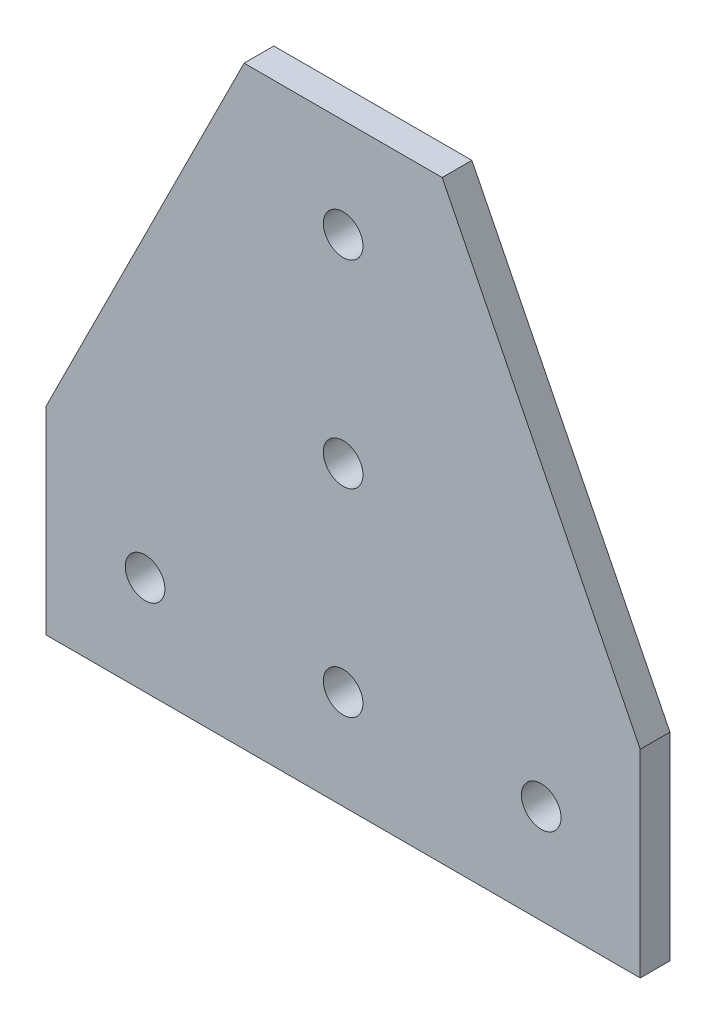
ISO-10303-21;
HEADER;
FILE_DESCRIPTION(('STEP AP214'),'2;1');
FILE_NAME('part.step','',(''),(''),'','','');
FILE_SCHEMA(('AUTOMOTIVE_DESIGN { 1 0 10303 214 1 1 1 1 }'));
ENDSEC;
DATA;
#1=APPLICATION_CONTEXT('core data for automotive mechanical design processes');
#2=APPLICATION_PROTOCOL_DEFINITION('international standard','automotive_design',2000,#1);
#3=PRODUCT_CONTEXT('',#1,'mechanical');
#4=PRODUCT('Part','Part','',(#3));
#5=PRODUCT_RELATED_PRODUCT_CATEGORY('part','',(#4));
#6=PRODUCT_DEFINITION_FORMATION('','',#4);
#7=PRODUCT_DEFINITION_CONTEXT('part definition',#1,'design');
#8=PRODUCT_DEFINITION('design','',#6,#7);
#9=PRODUCT_DEFINITION_SHAPE('','',#8);
#10=(LENGTH_UNIT() NAMED_UNIT(*) SI_UNIT(.MILLI.,.METRE.));
#11=(NAMED_UNIT(*) PLANE_ANGLE_UNIT() SI_UNIT($,.RADIAN.));
#12=(NAMED_UNIT(*) SI_UNIT($,.STERADIAN.) SOLID_ANGLE_UNIT());
#13=UNCERTAINTY_MEASURE_WITH_UNIT(LENGTH_MEASURE(1.E-05),#10,'distance_accuracy_value','');
#14=(GEOMETRIC_REPRESENTATION_CONTEXT(3) GLOBAL_UNCERTAINTY_ASSIGNED_CONTEXT((#13)) GLOBAL_UNIT_ASSIGNED_CONTEXT((#10,
#11,#12)) REPRESENTATION_CONTEXT('',''));
#15=CARTESIAN_POINT('',(0.,0.,0.));
#16=DIRECTION('',(0.,0.,1.));
#17=DIRECTION('',(1.,0.,0.));
#18=AXIS2_PLACEMENT_3D('',#15,#16,#17);
#19=CARTESIAN_POINT('',(0.,0.,3.));
#20=DIRECTION('',(0.,0.,1.));
#21=DIRECTION('',(1.,0.,0.));
#22=AXIS2_PLACEMENT_3D('',#19,#20,#21);
#23=PLANE('',#22);
#24=CARTESIAN_POINT('',(31.3459687494081,-73.3661563532401,3.));
#25=DIRECTION('',(0.,0.,1.));
#26=DIRECTION('',(1.,0.,0.));
#27=AXIS2_PLACEMENT_3D('',#24,#25,#26);
#28=CIRCLE('',#27,2.);
#29=CARTESIAN_POINT('',(33.3459687494081,-73.3661563532401,3.));
#30=VERTEX_POINT('',#29);
#31=EDGE_CURVE('E222',#30,#30,#28,.T.);
#32=ORIENTED_EDGE('',*,*,#31,.F.);
#33=EDGE_LOOP('',(#32));
#34=FACE_BOUND('',#33,.T.);
#35=CARTESIAN_POINT('',(31.3459687494081,-53.36615635324,3.));
#36=DIRECTION('',(0.,0.,1.));
#37=DIRECTION('',(1.,0.,0.));
#38=AXIS2_PLACEMENT_3D('',#35,#36,#37);
#39=CIRCLE('',#38,1.99999999999911);
#40=CARTESIAN_POINT('',(33.3459687494072,-53.36615635324,3.));
#41=VERTEX_POINT('',#40);
#42=EDGE_CURVE('E238',#41,#41,#39,.T.);
#43=ORIENTED_EDGE('',*,*,#42,.F.);
#44=EDGE_LOOP('',(#43));
#45=FACE_BOUND('',#44,.T.);
#46=DIRECTION('',(0.,-1.,0.));
#47=VECTOR('',#46,1.);
#48=CARTESIAN_POINT('',(1.34596874940809,-63.3661563532401,3.));
#49=LINE('',#48,#47);
#50=CARTESIAN_POINT('',(1.34596874940809,-63.3661563532401,3.));
#51=VERTEX_POINT('',#50);
#52=CARTESIAN_POINT('',(1.34596874940809,-83.3661563532401,3.));
#53=VERTEX_POINT('',#52);
#54=EDGE_CURVE('E152',#51,#53,#49,.T.);
#55=ORIENTED_EDGE('',*,*,#54,.T.);
#56=DIRECTION('',(1.,0.,0.));
#57=VECTOR('',#56,1.);
#58=CARTESIAN_POINT('',(1.34596874940809,-83.3661563532401,3.));
#59=LINE('',#58,#57);
#60=CARTESIAN_POINT('',(61.3459687494081,-83.3661563532401,3.));
#61=VERTEX_POINT('',#60);
#62=EDGE_CURVE('E100',#53,#61,#59,.T.);
#63=ORIENTED_EDGE('',*,*,#62,.T.);
#64=DIRECTION('',(0.,1.,0.));
#65=VECTOR('',#64,1.);
#66=CARTESIAN_POINT('',(61.3459687494081,-83.3661563532401,3.));
#67=LINE('',#66,#65);
#68=CARTESIAN_POINT('',(61.3459687494081,-63.3661563532401,3.));
#69=VERTEX_POINT('',#68);
#70=EDGE_CURVE('E113',#61,#69,#67,.T.);
#71=ORIENTED_EDGE('',*,*,#70,.T.);
#72=DIRECTION('',(-0.447213595499957,0.894427190999916,0.));
#73=VECTOR('',#72,1.);
#74=CARTESIAN_POINT('',(61.3459687494081,-63.3661563532401,3.));
#75=LINE('',#74,#73);
#76=CARTESIAN_POINT('',(41.3459687494081,-23.36615635324,3.));
#77=VERTEX_POINT('',#76);
#78=EDGE_CURVE('E107',#69,#77,#75,.T.);
#79=ORIENTED_EDGE('',*,*,#78,.T.);
#80=DIRECTION('',(-1.,0.,0.));
#81=VECTOR('',#80,1.);
#82=CARTESIAN_POINT('',(41.3459687494081,-23.36615635324,3.));
#83=LINE('',#82,#81);
#84=CARTESIAN_POINT('',(21.3459687494081,-23.36615635324,3.));
#85=VERTEX_POINT('',#84);
#86=EDGE_CURVE('E111',#77,#85,#83,.T.);
#87=ORIENTED_EDGE('',*,*,#86,.T.);
#88=DIRECTION('',(-0.447213595499957,-0.894427190999916,0.));
#89=VECTOR('',#88,1.);
#90=CARTESIAN_POINT('',(21.3459687494081,-23.36615635324,3.));
#91=LINE('',#90,#89);
#92=EDGE_CURVE('E63',#85,#51,#91,.T.);
#93=ORIENTED_EDGE('',*,*,#92,.T.);
#94=EDGE_LOOP('',(#55,#63,#71,#79,#87,#93));
#95=FACE_BOUND('',#94,.T.);
#96=CARTESIAN_POINT('',(31.3459687494081,-33.36615635324,3.));
#97=DIRECTION('',(0.,0.,1.));
#98=DIRECTION('',(1.,0.,0.));
#99=AXIS2_PLACEMENT_3D('',#96,#97,#98);
#100=CIRCLE('',#99,2.00000000000005);
#101=CARTESIAN_POINT('',(33.3459687494081,-33.36615635324,3.));
#102=VERTEX_POINT('',#101);
#103=EDGE_CURVE('E140',#102,#102,#100,.T.);
#104=ORIENTED_EDGE('',*,*,#103,.F.);
#105=EDGE_LOOP('',(#104));
#106=FACE_BOUND('',#105,.T.);
#107=CARTESIAN_POINT('',(11.3459687494081,-73.3661563532401,3.));
#108=DIRECTION('',(0.,0.,1.));
#109=DIRECTION('',(1.,0.,0.));
#110=AXIS2_PLACEMENT_3D('',#107,#108,#109);
#111=CIRCLE('',#110,2.);
#112=CARTESIAN_POINT('',(13.3459687494081,-73.3661563532401,3.));
#113=VERTEX_POINT('',#112);
#114=EDGE_CURVE('E230',#113,#113,#111,.T.);
#115=ORIENTED_EDGE('',*,*,#114,.F.);
#116=EDGE_LOOP('',(#115));
#117=FACE_BOUND('',#116,.T.);
#118=CARTESIAN_POINT('',(51.3459687494081,-73.3661563532401,3.));
#119=DIRECTION('',(0.,0.,1.));
#120=DIRECTION('',(1.,0.,0.));
#121=AXIS2_PLACEMENT_3D('',#118,#119,#120);
#122=CIRCLE('',#121,2.00000000000002);
#123=CARTESIAN_POINT('',(53.3459687494081,-73.3661563532401,3.));
#124=VERTEX_POINT('',#123);
#125=EDGE_CURVE('E211',#124,#124,#122,.T.);
#126=ORIENTED_EDGE('',*,*,#125,.F.);
#127=EDGE_LOOP('',(#126));
#128=FACE_BOUND('',#127,.T.);
#129=ADVANCED_FACE('F45',(#34,#45,#95,#106,#117,#128),#23,.T.);
#130=CARTESIAN_POINT('',(0.,0.,0.));
#131=DIRECTION('',(0.,0.,1.));
#132=DIRECTION('',(1.,0.,0.));
#133=AXIS2_PLACEMENT_3D('',#130,#131,#132);
#134=PLANE('',#133);
#135=DIRECTION('',(0.,-1.,0.));
#136=VECTOR('',#135,1.);
#137=CARTESIAN_POINT('',(1.34596874940809,-63.3661563532401,0.));
#138=LINE('',#137,#136);
#139=CARTESIAN_POINT('',(1.34596874940809,-63.3661563532401,0.));
#140=VERTEX_POINT('',#139);
#141=CARTESIAN_POINT('',(1.34596874940809,-83.3661563532401,0.));
#142=VERTEX_POINT('',#141);
#143=EDGE_CURVE('E135',#140,#142,#138,.T.);
#144=ORIENTED_EDGE('',*,*,#143,.F.);
#145=DIRECTION('',(-0.447213595499957,-0.894427190999916,0.));
#146=VECTOR('',#145,1.);
#147=CARTESIAN_POINT('',(21.3459687494081,-23.36615635324,0.));
#148=LINE('',#147,#146);
#149=CARTESIAN_POINT('',(21.3459687494081,-23.36615635324,0.));
#150=VERTEX_POINT('',#149);
#151=EDGE_CURVE('E92',#150,#140,#148,.T.);
#152=ORIENTED_EDGE('',*,*,#151,.F.);
#153=DIRECTION('',(-1.,0.,0.));
#154=VECTOR('',#153,1.);
#155=CARTESIAN_POINT('',(41.3459687494081,-23.36615635324,0.));
#156=LINE('',#155,#154);
#157=CARTESIAN_POINT('',(41.3459687494081,-23.36615635324,0.));
#158=VERTEX_POINT('',#157);
#159=EDGE_CURVE('E86',#158,#150,#156,.T.);
#160=ORIENTED_EDGE('',*,*,#159,.F.);
#161=DIRECTION('',(-0.447213595499957,0.894427190999916,0.));
#162=VECTOR('',#161,1.);
#163=CARTESIAN_POINT('',(61.3459687494081,-63.3661563532401,0.));
#164=LINE('',#163,#162);
#165=CARTESIAN_POINT('',(61.3459687494081,-63.3661563532401,0.));
#166=VERTEX_POINT('',#165);
#167=EDGE_CURVE('E122',#166,#158,#164,.T.);
#168=ORIENTED_EDGE('',*,*,#167,.F.);
#169=DIRECTION('',(0.,1.,0.));
#170=VECTOR('',#169,1.);
#171=CARTESIAN_POINT('',(61.3459687494081,-83.3661563532401,0.));
#172=LINE('',#171,#170);
#173=CARTESIAN_POINT('',(61.3459687494081,-83.3661563532401,0.));
#174=VERTEX_POINT('',#173);
#175=EDGE_CURVE('E143',#174,#166,#172,.T.);
#176=ORIENTED_EDGE('',*,*,#175,.F.);
#177=DIRECTION('',(1.,0.,0.));
#178=VECTOR('',#177,1.);
#179=CARTESIAN_POINT('',(1.34596874940809,-83.3661563532401,0.));
#180=LINE('',#179,#178);
#181=EDGE_CURVE('E139',#142,#174,#180,.T.);
#182=ORIENTED_EDGE('',*,*,#181,.F.);
#183=EDGE_LOOP('',(#144,#152,#160,#168,#176,#182));
#184=FACE_BOUND('',#183,.T.);
#185=CARTESIAN_POINT('',(31.3459687494081,-33.36615635324,0.));
#186=DIRECTION('',(0.,0.,1.));
#187=DIRECTION('',(1.,0.,0.));
#188=AXIS2_PLACEMENT_3D('',#185,#186,#187);
#189=CIRCLE('',#188,2.00000000000005);
#190=CARTESIAN_POINT('',(33.3459687494081,-33.36615635324,0.));
#191=VERTEX_POINT('',#190);
#192=EDGE_CURVE('E242',#191,#191,#189,.T.);
#193=ORIENTED_EDGE('',*,*,#192,.T.);
#194=EDGE_LOOP('',(#193));
#195=FACE_BOUND('',#194,.T.);
#196=CARTESIAN_POINT('',(31.3459687494081,-53.36615635324,0.));
#197=DIRECTION('',(0.,0.,1.));
#198=DIRECTION('',(1.,0.,0.));
#199=AXIS2_PLACEMENT_3D('',#196,#197,#198);
#200=CIRCLE('',#199,1.99999999999911);
#201=CARTESIAN_POINT('',(33.3459687494072,-53.36615635324,0.));
#202=VERTEX_POINT('',#201);
#203=EDGE_CURVE('E234',#202,#202,#200,.T.);
#204=ORIENTED_EDGE('',*,*,#203,.T.);
#205=EDGE_LOOP('',(#204));
#206=FACE_BOUND('',#205,.T.);
#207=CARTESIAN_POINT('',(11.3459687494081,-73.3661563532401,0.));
#208=DIRECTION('',(0.,0.,1.));
#209=DIRECTION('',(1.,0.,0.));
#210=AXIS2_PLACEMENT_3D('',#207,#208,#209);
#211=CIRCLE('',#210,2.);
#212=CARTESIAN_POINT('',(13.3459687494081,-73.3661563532401,0.));
#213=VERTEX_POINT('',#212);
#214=EDGE_CURVE('E226',#213,#213,#211,.T.);
#215=ORIENTED_EDGE('',*,*,#214,.T.);
#216=EDGE_LOOP('',(#215));
#217=FACE_BOUND('',#216,.T.);
#218=CARTESIAN_POINT('',(31.3459687494081,-73.3661563532401,0.));
#219=DIRECTION('',(0.,0.,1.));
#220=DIRECTION('',(1.,0.,0.));
#221=AXIS2_PLACEMENT_3D('',#218,#219,#220);
#222=CIRCLE('',#221,2.);
#223=CARTESIAN_POINT('',(33.3459687494081,-73.3661563532401,0.));
#224=VERTEX_POINT('',#223);
#225=EDGE_CURVE('E219',#224,#224,#222,.T.);
#226=ORIENTED_EDGE('',*,*,#225,.T.);
#227=EDGE_LOOP('',(#226));
#228=FACE_BOUND('',#227,.T.);
#229=CARTESIAN_POINT('',(51.3459687494081,-73.3661563532401,0.));
#230=DIRECTION('',(0.,0.,1.));
#231=DIRECTION('',(1.,0.,0.));
#232=AXIS2_PLACEMENT_3D('',#229,#230,#231);
#233=CIRCLE('',#232,2.00000000000002);
#234=CARTESIAN_POINT('',(53.3459687494081,-73.3661563532401,0.));
#235=VERTEX_POINT('',#234);
#236=EDGE_CURVE('E214',#235,#235,#233,.T.);
#237=ORIENTED_EDGE('',*,*,#236,.T.);
#238=EDGE_LOOP('',(#237));
#239=FACE_BOUND('',#238,.T.);
#240=ADVANCED_FACE('F165',(#184,#195,#206,#217,#228,#239),#134,.F.);
#241=CARTESIAN_POINT('',(1.34596874940809,-63.3661563532401,3.));
#242=DIRECTION('',(1.,0.,0.));
#243=DIRECTION('',(0.,0.,-1.));
#244=AXIS2_PLACEMENT_3D('',#241,#242,#243);
#245=PLANE('',#244);
#246=ORIENTED_EDGE('',*,*,#143,.T.);
#247=DIRECTION('',(0.,0.,-1.));
#248=VECTOR('',#247,1.);
#249=CARTESIAN_POINT('',(1.34596874940809,-83.3661563532401,3.));
#250=LINE('',#249,#248);
#251=EDGE_CURVE('E11',#53,#142,#250,.T.);
#252=ORIENTED_EDGE('',*,*,#251,.F.);
#253=ORIENTED_EDGE('',*,*,#54,.F.);
#254=DIRECTION('',(0.,0.,-1.));
#255=VECTOR('',#254,1.);
#256=CARTESIAN_POINT('',(1.34596874940809,-63.3661563532401,3.));
#257=LINE('',#256,#255);
#258=EDGE_CURVE('E131',#51,#140,#257,.T.);
#259=ORIENTED_EDGE('',*,*,#258,.T.);
#260=EDGE_LOOP('',(#246,#252,#253,#259));
#261=FACE_BOUND('',#260,.T.);
#262=ADVANCED_FACE('F47',(#261),#245,.F.);
#263=CARTESIAN_POINT('',(1.34596874940809,-83.3661563532401,3.));
#264=DIRECTION('',(0.,1.,0.));
#265=DIRECTION('',(0.,0.,1.));
#266=AXIS2_PLACEMENT_3D('',#263,#264,#265);
#267=PLANE('',#266);
#268=ORIENTED_EDGE('',*,*,#181,.T.);
#269=DIRECTION('',(0.,0.,-1.));
#270=VECTOR('',#269,1.);
#271=CARTESIAN_POINT('',(61.3459687494081,-83.3661563532401,3.));
#272=LINE('',#271,#270);
#273=EDGE_CURVE('E55',#61,#174,#272,.T.);
#274=ORIENTED_EDGE('',*,*,#273,.F.);
#275=ORIENTED_EDGE('',*,*,#62,.F.);
#276=ORIENTED_EDGE('',*,*,#251,.T.);
#277=EDGE_LOOP('',(#268,#274,#275,#276));
#278=FACE_BOUND('',#277,.T.);
#279=ADVANCED_FACE('F320',(#278),#267,.F.);
#280=CARTESIAN_POINT('',(61.3459687494081,-83.3661563532401,3.));
#281=DIRECTION('',(-1.,0.,0.));
#282=DIRECTION('',(0.,0.,1.));
#283=AXIS2_PLACEMENT_3D('',#280,#281,#282);
#284=PLANE('',#283);
#285=ORIENTED_EDGE('',*,*,#175,.T.);
#286=DIRECTION('',(0.,0.,-1.));
#287=VECTOR('',#286,1.);
#288=CARTESIAN_POINT('',(61.3459687494081,-63.3661563532401,3.));
#289=LINE('',#288,#287);
#290=EDGE_CURVE('E124',#69,#166,#289,.T.);
#291=ORIENTED_EDGE('',*,*,#290,.F.);
#292=ORIENTED_EDGE('',*,*,#70,.F.);
#293=ORIENTED_EDGE('',*,*,#273,.T.);
#294=EDGE_LOOP('',(#285,#291,#292,#293));
#295=FACE_BOUND('',#294,.T.);
#296=ADVANCED_FACE('F162',(#295),#284,.F.);
#297=CARTESIAN_POINT('',(61.3459687494081,-63.3661563532401,3.));
#298=DIRECTION('',(-0.894427190999916,-0.447213595499957,0.));
#299=DIRECTION('',(0.447213595499957,-0.894427190999916,0.));
#300=AXIS2_PLACEMENT_3D('',#297,#298,#299);
#301=PLANE('',#300);
#302=ORIENTED_EDGE('',*,*,#167,.T.);
#303=DIRECTION('',(0.,0.,-1.));
#304=VECTOR('',#303,1.);
#305=CARTESIAN_POINT('',(41.3459687494081,-23.36615635324,3.));
#306=LINE('',#305,#304);
#307=EDGE_CURVE('E119',#77,#158,#306,.T.);
#308=ORIENTED_EDGE('',*,*,#307,.F.);
#309=ORIENTED_EDGE('',*,*,#78,.F.);
#310=ORIENTED_EDGE('',*,*,#290,.T.);
#311=EDGE_LOOP('',(#302,#308,#309,#310));
#312=FACE_BOUND('',#311,.T.);
#313=ADVANCED_FACE('F120',(#312),#301,.F.);
#314=CARTESIAN_POINT('',(41.3459687494081,-23.36615635324,3.));
#315=DIRECTION('',(0.,-1.,0.));
#316=DIRECTION('',(0.,0.,-1.));
#317=AXIS2_PLACEMENT_3D('',#314,#315,#316);
#318=PLANE('',#317);
#319=ORIENTED_EDGE('',*,*,#159,.T.);
#320=DIRECTION('',(0.,0.,-1.));
#321=VECTOR('',#320,1.);
#322=CARTESIAN_POINT('',(21.3459687494081,-23.36615635324,3.));
#323=LINE('',#322,#321);
#324=EDGE_CURVE('E125',#85,#150,#323,.T.);
#325=ORIENTED_EDGE('',*,*,#324,.F.);
#326=ORIENTED_EDGE('',*,*,#86,.F.);
#327=ORIENTED_EDGE('',*,*,#307,.T.);
#328=EDGE_LOOP('',(#319,#325,#326,#327));
#329=FACE_BOUND('',#328,.T.);
#330=ADVANCED_FACE('F127',(#329),#318,.F.);
#331=CARTESIAN_POINT('',(21.3459687494081,-23.36615635324,3.));
#332=DIRECTION('',(0.894427190999916,-0.447213595499957,0.));
#333=DIRECTION('',(0.447213595499957,0.894427190999916,0.));
#334=AXIS2_PLACEMENT_3D('',#331,#332,#333);
#335=PLANE('',#334);
#336=ORIENTED_EDGE('',*,*,#151,.T.);
#337=ORIENTED_EDGE('',*,*,#258,.F.);
#338=ORIENTED_EDGE('',*,*,#92,.F.);
#339=ORIENTED_EDGE('',*,*,#324,.T.);
#340=EDGE_LOOP('',(#336,#337,#338,#339));
#341=FACE_BOUND('',#340,.T.);
#342=ADVANCED_FACE('F170',(#341),#335,.F.);
#343=CARTESIAN_POINT('',(31.3459687494081,-33.36615635324,3.));
#344=DIRECTION('',(0.,0.,-1.));
#345=DIRECTION('',(-1.,0.,0.));
#346=AXIS2_PLACEMENT_3D('',#343,#344,#345);
#347=CYLINDRICAL_SURFACE('',#346,2.00000000000005);
#348=ORIENTED_EDGE('',*,*,#103,.T.);
#349=EDGE_LOOP('',(#348));
#350=FACE_BOUND('',#349,.T.);
#351=ORIENTED_EDGE('',*,*,#192,.F.);
#352=EDGE_LOOP('',(#351));
#353=FACE_BOUND('',#352,.T.);
#354=ADVANCED_FACE('F172',(#350,#353),#347,.F.);
#355=CARTESIAN_POINT('',(31.3459687494081,-53.36615635324,3.));
#356=DIRECTION('',(0.,0.,-1.));
#357=DIRECTION('',(-1.,0.,0.));
#358=AXIS2_PLACEMENT_3D('',#355,#356,#357);
#359=CYLINDRICAL_SURFACE('',#358,1.99999999999911);
#360=ORIENTED_EDGE('',*,*,#42,.T.);
#361=EDGE_LOOP('',(#360));
#362=FACE_BOUND('',#361,.T.);
#363=ORIENTED_EDGE('',*,*,#203,.F.);
#364=EDGE_LOOP('',(#363));
#365=FACE_BOUND('',#364,.T.);
#366=ADVANCED_FACE('F178',(#362,#365),#359,.F.);
#367=CARTESIAN_POINT('',(11.3459687494081,-73.3661563532401,3.));
#368=DIRECTION('',(0.,0.,-1.));
#369=DIRECTION('',(-1.,0.,0.));
#370=AXIS2_PLACEMENT_3D('',#367,#368,#369);
#371=CYLINDRICAL_SURFACE('',#370,2.);
#372=ORIENTED_EDGE('',*,*,#114,.T.);
#373=EDGE_LOOP('',(#372));
#374=FACE_BOUND('',#373,.T.);
#375=ORIENTED_EDGE('',*,*,#214,.F.);
#376=EDGE_LOOP('',(#375));
#377=FACE_BOUND('',#376,.T.);
#378=ADVANCED_FACE('F194',(#374,#377),#371,.F.);
#379=CARTESIAN_POINT('',(31.3459687494081,-73.3661563532401,3.));
#380=DIRECTION('',(0.,0.,-1.));
#381=DIRECTION('',(-1.,0.,0.));
#382=AXIS2_PLACEMENT_3D('',#379,#380,#381);
#383=CYLINDRICAL_SURFACE('',#382,2.);
#384=ORIENTED_EDGE('',*,*,#31,.T.);
#385=EDGE_LOOP('',(#384));
#386=FACE_BOUND('',#385,.T.);
#387=ORIENTED_EDGE('',*,*,#225,.F.);
#388=EDGE_LOOP('',(#387));
#389=FACE_BOUND('',#388,.T.);
#390=ADVANCED_FACE('F198',(#386,#389),#383,.F.);
#391=CARTESIAN_POINT('',(51.3459687494081,-73.3661563532401,3.));
#392=DIRECTION('',(0.,0.,-1.));
#393=DIRECTION('',(-1.,0.,0.));
#394=AXIS2_PLACEMENT_3D('',#391,#392,#393);
#395=CYLINDRICAL_SURFACE('',#394,2.00000000000002);
#396=ORIENTED_EDGE('',*,*,#125,.T.);
#397=EDGE_LOOP('',(#396));
#398=FACE_BOUND('',#397,.T.);
#399=ORIENTED_EDGE('',*,*,#236,.F.);
#400=EDGE_LOOP('',(#399));
#401=FACE_BOUND('',#400,.T.);
#402=ADVANCED_FACE('F202',(#398,#401),#395,.F.);
#403=CLOSED_SHELL('',(#129,#240,#262,#279,#296,#313,#330,#342,#354,#366,#378,#390,#402));
#404=MANIFOLD_SOLID_BREP('B2',#403);
#405=ADVANCED_BREP_SHAPE_REPRESENTATION('',(#18,#404),#14);
#406=SHAPE_DEFINITION_REPRESENTATION(#9,#405);
ENDSEC;
END-ISO-10303-21;
